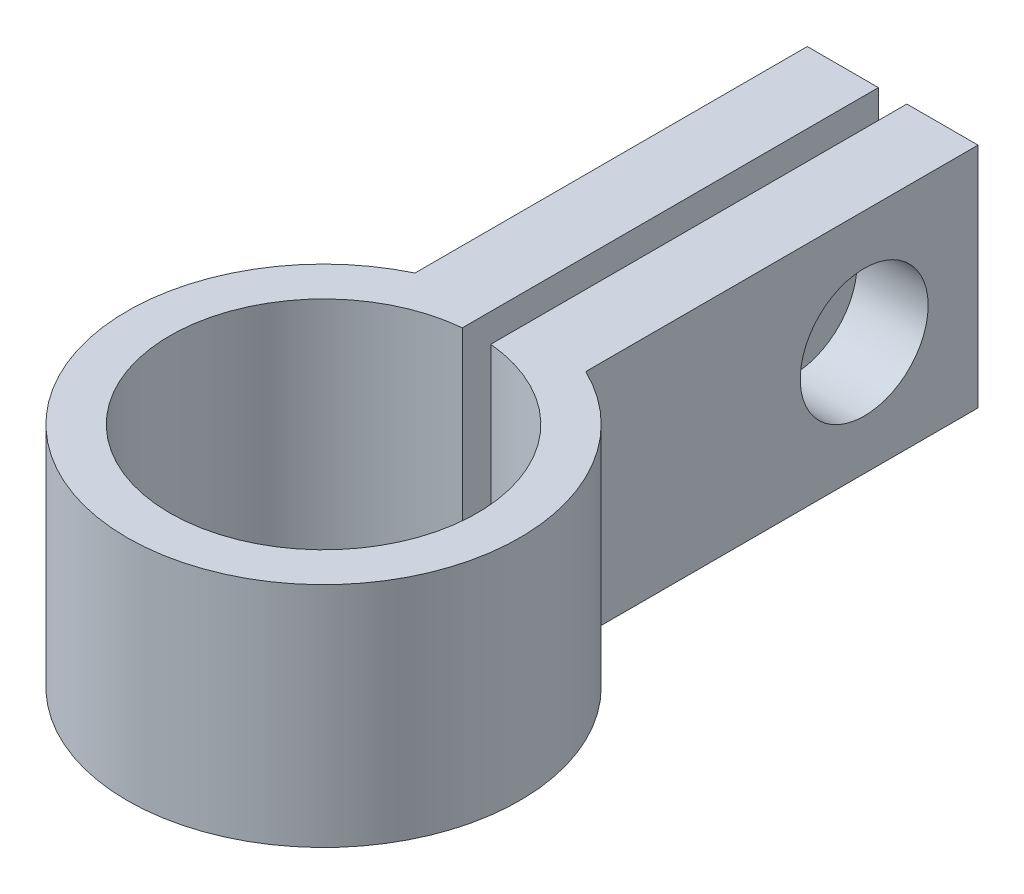
ISO-10303-21;
HEADER;
FILE_DESCRIPTION(('STEP AP214'),'2;1');
FILE_NAME('part.step','',(''),(''),'','','');
FILE_SCHEMA(('AUTOMOTIVE_DESIGN { 1 0 10303 214 1 1 1 1 }'));
ENDSEC;
DATA;
#1=APPLICATION_CONTEXT('core data for automotive mechanical design processes');
#2=APPLICATION_PROTOCOL_DEFINITION('international standard','automotive_design',2000,#1);
#3=PRODUCT_CONTEXT('',#1,'mechanical');
#4=PRODUCT('Part','Part','',(#3));
#5=PRODUCT_RELATED_PRODUCT_CATEGORY('part','',(#4));
#6=PRODUCT_DEFINITION_FORMATION('','',#4);
#7=PRODUCT_DEFINITION_CONTEXT('part definition',#1,'design');
#8=PRODUCT_DEFINITION('design','',#6,#7);
#9=PRODUCT_DEFINITION_SHAPE('','',#8);
#10=(LENGTH_UNIT() NAMED_UNIT(*) SI_UNIT(.MILLI.,.METRE.));
#11=(NAMED_UNIT(*) PLANE_ANGLE_UNIT() SI_UNIT($,.RADIAN.));
#12=(NAMED_UNIT(*) SI_UNIT($,.STERADIAN.) SOLID_ANGLE_UNIT());
#13=UNCERTAINTY_MEASURE_WITH_UNIT(LENGTH_MEASURE(1.E-05),#10,'distance_accuracy_value','');
#14=(GEOMETRIC_REPRESENTATION_CONTEXT(3) GLOBAL_UNCERTAINTY_ASSIGNED_CONTEXT((#13)) GLOBAL_UNIT_ASSIGNED_CONTEXT((#10,
#11,#12)) REPRESENTATION_CONTEXT('',''));
#15=CARTESIAN_POINT('',(0.,0.,0.));
#16=DIRECTION('',(0.,0.,1.));
#17=DIRECTION('',(1.,0.,0.));
#18=AXIS2_PLACEMENT_3D('',#15,#16,#17);
#19=CARTESIAN_POINT('',(0.,8.,0.));
#20=DIRECTION('',(0.,-1.,0.));
#21=DIRECTION('',(0.,0.,-1.));
#22=AXIS2_PLACEMENT_3D('',#19,#20,#21);
#23=CYLINDRICAL_SURFACE('',#22,5.4);
#24=CARTESIAN_POINT('',(0.,0.,0.));
#25=DIRECTION('',(0.,1.,0.));
#26=DIRECTION('',(0.,0.,1.));
#27=AXIS2_PLACEMENT_3D('',#24,#25,#26);
#28=CIRCLE('',#27,5.4);
#29=CARTESIAN_POINT('',(-0.5,0.,-5.37680202350803));
#30=VERTEX_POINT('',#29);
#31=CARTESIAN_POINT('',(0.5,0.,-5.37680202350803));
#32=VERTEX_POINT('',#31);
#33=EDGE_CURVE('E131',#30,#32,#28,.T.);
#34=ORIENTED_EDGE('',*,*,#33,.F.);
#35=DIRECTION('',(0.,-1.,0.));
#36=VECTOR('',#35,1.);
#37=CARTESIAN_POINT('',(-0.5,8.,-5.37680202350803));
#38=LINE('',#37,#36);
#39=CARTESIAN_POINT('',(-0.5,8.,-5.37680202350803));
#40=VERTEX_POINT('',#39);
#41=EDGE_CURVE('E11',#40,#30,#38,.T.);
#42=ORIENTED_EDGE('',*,*,#41,.F.);
#43=CARTESIAN_POINT('',(0.,8.,0.));
#44=DIRECTION('',(0.,1.,0.));
#45=DIRECTION('',(0.,0.,1.));
#46=AXIS2_PLACEMENT_3D('',#43,#44,#45);
#47=CIRCLE('',#46,5.4);
#48=CARTESIAN_POINT('',(0.5,8.,-5.37680202350803));
#49=VERTEX_POINT('',#48);
#50=EDGE_CURVE('E150',#40,#49,#47,.T.);
#51=ORIENTED_EDGE('',*,*,#50,.T.);
#52=DIRECTION('',(0.,-1.,0.));
#53=VECTOR('',#52,1.);
#54=CARTESIAN_POINT('',(0.5,8.,-5.37680202350803));
#55=LINE('',#54,#53);
#56=EDGE_CURVE('E52',#49,#32,#55,.T.);
#57=ORIENTED_EDGE('',*,*,#56,.T.);
#58=EDGE_LOOP('',(#34,#42,#51,#57));
#59=FACE_BOUND('',#58,.T.);
#60=ADVANCED_FACE('F35',(#59),#23,.F.);
#61=CARTESIAN_POINT('',(-0.5,8.,0.));
#62=DIRECTION('',(-1.,0.,0.));
#63=DIRECTION('',(0.,0.,1.));
#64=AXIS2_PLACEMENT_3D('',#61,#62,#63);
#65=PLANE('',#64);
#66=CARTESIAN_POINT('',(-0.5,4.,-16.));
#67=DIRECTION('',(-1.,0.,0.));
#68=DIRECTION('',(0.,0.,1.));
#69=AXIS2_PLACEMENT_3D('',#66,#67,#68);
#70=CIRCLE('',#69,2.2479);
#71=CARTESIAN_POINT('',(-0.5,4.,-13.7521));
#72=VERTEX_POINT('',#71);
#73=EDGE_CURVE('E184',#72,#72,#70,.T.);
#74=ORIENTED_EDGE('',*,*,#73,.T.);
#75=EDGE_LOOP('',(#74));
#76=FACE_BOUND('',#75,.T.);
#77=DIRECTION('',(0.,0.,-1.));
#78=VECTOR('',#77,1.);
#79=CARTESIAN_POINT('',(-0.5,0.,0.));
#80=LINE('',#79,#78);
#81=CARTESIAN_POINT('',(-0.5,0.,-20.));
#82=VERTEX_POINT('',#81);
#83=EDGE_CURVE('E133',#30,#82,#80,.T.);
#84=ORIENTED_EDGE('',*,*,#83,.T.);
#85=DIRECTION('',(0.,-1.,0.));
#86=VECTOR('',#85,1.);
#87=CARTESIAN_POINT('',(-0.5,8.,-20.));
#88=LINE('',#87,#86);
#89=CARTESIAN_POINT('',(-0.5,8.,-20.));
#90=VERTEX_POINT('',#89);
#91=EDGE_CURVE('E44',#90,#82,#88,.T.);
#92=ORIENTED_EDGE('',*,*,#91,.F.);
#93=DIRECTION('',(0.,0.,-1.));
#94=VECTOR('',#93,1.);
#95=CARTESIAN_POINT('',(-0.5,8.,0.));
#96=LINE('',#95,#94);
#97=EDGE_CURVE('E177',#40,#90,#96,.T.);
#98=ORIENTED_EDGE('',*,*,#97,.F.);
#99=ORIENTED_EDGE('',*,*,#41,.T.);
#100=EDGE_LOOP('',(#84,#92,#98,#99));
#101=FACE_BOUND('',#100,.T.);
#102=ADVANCED_FACE('F200',(#76,#101),#65,.F.);
#103=CARTESIAN_POINT('',(0.,8.,-20.));
#104=DIRECTION('',(0.,0.,1.));
#105=DIRECTION('',(1.,0.,0.));
#106=AXIS2_PLACEMENT_3D('',#103,#104,#105);
#107=PLANE('',#106);
#108=DIRECTION('',(-1.,0.,0.));
#109=VECTOR('',#108,1.);
#110=CARTESIAN_POINT('',(0.,0.,-20.));
#111=LINE('',#110,#109);
#112=CARTESIAN_POINT('',(-3.,0.,-20.));
#113=VERTEX_POINT('',#112);
#114=EDGE_CURVE('E136',#82,#113,#111,.T.);
#115=ORIENTED_EDGE('',*,*,#114,.T.);
#116=DIRECTION('',(0.,-1.,0.));
#117=VECTOR('',#116,1.);
#118=CARTESIAN_POINT('',(-3.,8.,-20.));
#119=LINE('',#118,#117);
#120=CARTESIAN_POINT('',(-3.,8.,-20.));
#121=VERTEX_POINT('',#120);
#122=EDGE_CURVE('E156',#121,#113,#119,.T.);
#123=ORIENTED_EDGE('',*,*,#122,.F.);
#124=DIRECTION('',(-1.,0.,0.));
#125=VECTOR('',#124,1.);
#126=CARTESIAN_POINT('',(0.,8.,-20.));
#127=LINE('',#126,#125);
#128=EDGE_CURVE('E165',#90,#121,#127,.T.);
#129=ORIENTED_EDGE('',*,*,#128,.F.);
#130=ORIENTED_EDGE('',*,*,#91,.T.);
#131=EDGE_LOOP('',(#115,#123,#129,#130));
#132=FACE_BOUND('',#131,.T.);
#133=ADVANCED_FACE('F163',(#132),#107,.F.);
#134=CARTESIAN_POINT('',(-3.,8.,0.));
#135=DIRECTION('',(-1.,0.,0.));
#136=DIRECTION('',(0.,0.,1.));
#137=AXIS2_PLACEMENT_3D('',#134,#135,#136);
#138=PLANE('',#137);
#139=CARTESIAN_POINT('',(-3.,4.,-16.));
#140=DIRECTION('',(-1.,0.,0.));
#141=DIRECTION('',(0.,0.,1.));
#142=AXIS2_PLACEMENT_3D('',#139,#140,#141);
#143=CIRCLE('',#142,2.2479);
#144=CARTESIAN_POINT('',(-3.,4.,-13.7521));
#145=VERTEX_POINT('',#144);
#146=EDGE_CURVE('E134',#145,#145,#143,.T.);
#147=ORIENTED_EDGE('',*,*,#146,.F.);
#148=EDGE_LOOP('',(#147));
#149=FACE_BOUND('',#148,.T.);
#150=DIRECTION('',(0.,0.,-1.));
#151=VECTOR('',#150,1.);
#152=CARTESIAN_POINT('',(-3.,0.,0.));
#153=LINE('',#152,#151);
#154=CARTESIAN_POINT('',(-3.,0.,-6.21369455316239));
#155=VERTEX_POINT('',#154);
#156=EDGE_CURVE('E139',#155,#113,#153,.T.);
#157=ORIENTED_EDGE('',*,*,#156,.F.);
#158=DIRECTION('',(0.,-1.,0.));
#159=VECTOR('',#158,1.);
#160=CARTESIAN_POINT('',(-3.,8.,-6.21369455316239));
#161=LINE('',#160,#159);
#162=CARTESIAN_POINT('',(-3.,8.,-6.21369455316239));
#163=VERTEX_POINT('',#162);
#164=EDGE_CURVE('E154',#163,#155,#161,.T.);
#165=ORIENTED_EDGE('',*,*,#164,.F.);
#166=DIRECTION('',(0.,0.,-1.));
#167=VECTOR('',#166,1.);
#168=CARTESIAN_POINT('',(-3.,8.,0.));
#169=LINE('',#168,#167);
#170=EDGE_CURVE('E175',#163,#121,#169,.T.);
#171=ORIENTED_EDGE('',*,*,#170,.T.);
#172=ORIENTED_EDGE('',*,*,#122,.T.);
#173=EDGE_LOOP('',(#157,#165,#171,#172));
#174=FACE_BOUND('',#173,.T.);
#175=ADVANCED_FACE('F173',(#149,#174),#138,.T.);
#176=CARTESIAN_POINT('',(0.,8.,0.));
#177=DIRECTION('',(0.,-1.,0.));
#178=DIRECTION('',(0.,0.,-1.));
#179=AXIS2_PLACEMENT_3D('',#176,#177,#178);
#180=CYLINDRICAL_SURFACE('',#179,6.9);
#181=CARTESIAN_POINT('',(0.,0.,0.));
#182=DIRECTION('',(0.,1.,0.));
#183=DIRECTION('',(0.,0.,1.));
#184=AXIS2_PLACEMENT_3D('',#181,#182,#183);
#185=CIRCLE('',#184,6.9);
#186=CARTESIAN_POINT('',(3.,0.,-6.21369455316239));
#187=VERTEX_POINT('',#186);
#188=EDGE_CURVE('E142',#155,#187,#185,.T.);
#189=ORIENTED_EDGE('',*,*,#188,.T.);
#190=DIRECTION('',(0.,-1.,0.));
#191=VECTOR('',#190,1.);
#192=CARTESIAN_POINT('',(3.,8.,-6.21369455316239));
#193=LINE('',#192,#191);
#194=CARTESIAN_POINT('',(3.,8.,-6.21369455316239));
#195=VERTEX_POINT('',#194);
#196=EDGE_CURVE('E123',#195,#187,#193,.T.);
#197=ORIENTED_EDGE('',*,*,#196,.F.);
#198=CARTESIAN_POINT('',(0.,8.,0.));
#199=DIRECTION('',(0.,1.,0.));
#200=DIRECTION('',(0.,0.,1.));
#201=AXIS2_PLACEMENT_3D('',#198,#199,#200);
#202=CIRCLE('',#201,6.9);
#203=EDGE_CURVE('E111',#163,#195,#202,.T.);
#204=ORIENTED_EDGE('',*,*,#203,.F.);
#205=ORIENTED_EDGE('',*,*,#164,.T.);
#206=EDGE_LOOP('',(#189,#197,#204,#205));
#207=FACE_BOUND('',#206,.T.);
#208=ADVANCED_FACE('F212',(#207),#180,.T.);
#209=CARTESIAN_POINT('',(3.,8.,0.));
#210=DIRECTION('',(-1.,0.,0.));
#211=DIRECTION('',(0.,0.,1.));
#212=AXIS2_PLACEMENT_3D('',#209,#210,#211);
#213=PLANE('',#212);
#214=CARTESIAN_POINT('',(3.,4.,-16.));
#215=DIRECTION('',(1.,0.,0.));
#216=DIRECTION('',(0.,0.,-1.));
#217=AXIS2_PLACEMENT_3D('',#214,#215,#216);
#218=CIRCLE('',#217,2.2479);
#219=CARTESIAN_POINT('',(3.,4.,-18.2479));
#220=VERTEX_POINT('',#219);
#221=EDGE_CURVE('E187',#220,#220,#218,.T.);
#222=ORIENTED_EDGE('',*,*,#221,.F.);
#223=EDGE_LOOP('',(#222));
#224=FACE_BOUND('',#223,.T.);
#225=DIRECTION('',(0.,0.,-1.));
#226=VECTOR('',#225,1.);
#227=CARTESIAN_POINT('',(3.,0.,0.));
#228=LINE('',#227,#226);
#229=CARTESIAN_POINT('',(3.,0.,-20.));
#230=VERTEX_POINT('',#229);
#231=EDGE_CURVE('E120',#187,#230,#228,.T.);
#232=ORIENTED_EDGE('',*,*,#231,.T.);
#233=DIRECTION('',(0.,-1.,0.));
#234=VECTOR('',#233,1.);
#235=CARTESIAN_POINT('',(3.,8.,-20.));
#236=LINE('',#235,#234);
#237=CARTESIAN_POINT('',(3.,8.,-20.));
#238=VERTEX_POINT('',#237);
#239=EDGE_CURVE('E117',#238,#230,#236,.T.);
#240=ORIENTED_EDGE('',*,*,#239,.F.);
#241=DIRECTION('',(0.,0.,-1.));
#242=VECTOR('',#241,1.);
#243=CARTESIAN_POINT('',(3.,8.,0.));
#244=LINE('',#243,#242);
#245=EDGE_CURVE('E102',#195,#238,#244,.T.);
#246=ORIENTED_EDGE('',*,*,#245,.F.);
#247=ORIENTED_EDGE('',*,*,#196,.T.);
#248=EDGE_LOOP('',(#232,#240,#246,#247));
#249=FACE_BOUND('',#248,.T.);
#250=ADVANCED_FACE('F118',(#224,#249),#213,.F.);
#251=CARTESIAN_POINT('',(0.,8.,-20.));
#252=DIRECTION('',(0.,0.,1.));
#253=DIRECTION('',(1.,0.,0.));
#254=AXIS2_PLACEMENT_3D('',#251,#252,#253);
#255=PLANE('',#254);
#256=DIRECTION('',(-1.,0.,0.));
#257=VECTOR('',#256,1.);
#258=CARTESIAN_POINT('',(0.,0.,-20.));
#259=LINE('',#258,#257);
#260=CARTESIAN_POINT('',(0.5,0.,-20.));
#261=VERTEX_POINT('',#260);
#262=EDGE_CURVE('E145',#230,#261,#259,.T.);
#263=ORIENTED_EDGE('',*,*,#262,.T.);
#264=DIRECTION('',(0.,-1.,0.));
#265=VECTOR('',#264,1.);
#266=CARTESIAN_POINT('',(0.5,8.,-20.));
#267=LINE('',#266,#265);
#268=CARTESIAN_POINT('',(0.5,8.,-20.));
#269=VERTEX_POINT('',#268);
#270=EDGE_CURVE('E78',#269,#261,#267,.T.);
#271=ORIENTED_EDGE('',*,*,#270,.F.);
#272=DIRECTION('',(-1.,0.,0.));
#273=VECTOR('',#272,1.);
#274=CARTESIAN_POINT('',(0.,8.,-20.));
#275=LINE('',#274,#273);
#276=EDGE_CURVE('E108',#238,#269,#275,.T.);
#277=ORIENTED_EDGE('',*,*,#276,.F.);
#278=ORIENTED_EDGE('',*,*,#239,.T.);
#279=EDGE_LOOP('',(#263,#271,#277,#278));
#280=FACE_BOUND('',#279,.T.);
#281=ADVANCED_FACE('F125',(#280),#255,.F.);
#282=CARTESIAN_POINT('',(0.5,8.,0.));
#283=DIRECTION('',(-1.,0.,0.));
#284=DIRECTION('',(0.,0.,1.));
#285=AXIS2_PLACEMENT_3D('',#282,#283,#284);
#286=PLANE('',#285);
#287=CARTESIAN_POINT('',(0.5,4.,-16.));
#288=DIRECTION('',(-1.,0.,0.));
#289=DIRECTION('',(0.,0.,1.));
#290=AXIS2_PLACEMENT_3D('',#287,#288,#289);
#291=CIRCLE('',#290,2.2479);
#292=CARTESIAN_POINT('',(0.5,4.,-13.7521));
#293=VERTEX_POINT('',#292);
#294=EDGE_CURVE('E38',#293,#293,#291,.T.);
#295=ORIENTED_EDGE('',*,*,#294,.F.);
#296=EDGE_LOOP('',(#295));
#297=FACE_BOUND('',#296,.T.);
#298=DIRECTION('',(0.,0.,-1.));
#299=VECTOR('',#298,1.);
#300=CARTESIAN_POINT('',(0.5,0.,0.));
#301=LINE('',#300,#299);
#302=EDGE_CURVE('E147',#32,#261,#301,.T.);
#303=ORIENTED_EDGE('',*,*,#302,.F.);
#304=ORIENTED_EDGE('',*,*,#56,.F.);
#305=DIRECTION('',(0.,0.,-1.));
#306=VECTOR('',#305,1.);
#307=CARTESIAN_POINT('',(0.5,8.,0.));
#308=LINE('',#307,#306);
#309=EDGE_CURVE('E126',#49,#269,#308,.T.);
#310=ORIENTED_EDGE('',*,*,#309,.T.);
#311=ORIENTED_EDGE('',*,*,#270,.T.);
#312=EDGE_LOOP('',(#303,#304,#310,#311));
#313=FACE_BOUND('',#312,.T.);
#314=ADVANCED_FACE('F196',(#297,#313),#286,.T.);
#315=CARTESIAN_POINT('',(0.,8.,0.));
#316=DIRECTION('',(0.,1.,0.));
#317=DIRECTION('',(0.,0.,1.));
#318=AXIS2_PLACEMENT_3D('',#315,#316,#317);
#319=PLANE('',#318);
#320=ORIENTED_EDGE('',*,*,#50,.F.);
#321=ORIENTED_EDGE('',*,*,#97,.T.);
#322=ORIENTED_EDGE('',*,*,#128,.T.);
#323=ORIENTED_EDGE('',*,*,#170,.F.);
#324=ORIENTED_EDGE('',*,*,#203,.T.);
#325=ORIENTED_EDGE('',*,*,#245,.T.);
#326=ORIENTED_EDGE('',*,*,#276,.T.);
#327=ORIENTED_EDGE('',*,*,#309,.F.);
#328=EDGE_LOOP('',(#320,#321,#322,#323,#324,#325,#326,#327));
#329=FACE_BOUND('',#328,.T.);
#330=ADVANCED_FACE('F105',(#329),#319,.T.);
#331=CARTESIAN_POINT('',(0.,0.,0.));
#332=DIRECTION('',(0.,1.,0.));
#333=DIRECTION('',(0.,0.,1.));
#334=AXIS2_PLACEMENT_3D('',#331,#332,#333);
#335=PLANE('',#334);
#336=ORIENTED_EDGE('',*,*,#33,.T.);
#337=ORIENTED_EDGE('',*,*,#302,.T.);
#338=ORIENTED_EDGE('',*,*,#262,.F.);
#339=ORIENTED_EDGE('',*,*,#231,.F.);
#340=ORIENTED_EDGE('',*,*,#188,.F.);
#341=ORIENTED_EDGE('',*,*,#156,.T.);
#342=ORIENTED_EDGE('',*,*,#114,.F.);
#343=ORIENTED_EDGE('',*,*,#83,.F.);
#344=EDGE_LOOP('',(#336,#337,#338,#339,#340,#341,#342,#343));
#345=FACE_BOUND('',#344,.T.);
#346=ADVANCED_FACE('F169',(#345),#335,.F.);
#347=CARTESIAN_POINT('',(3.,4.,-16.));
#348=DIRECTION('',(1.,0.,0.));
#349=DIRECTION('',(0.,0.,-1.));
#350=AXIS2_PLACEMENT_3D('',#347,#348,#349);
#351=CYLINDRICAL_SURFACE('',#350,2.2479);
#352=ORIENTED_EDGE('',*,*,#294,.T.);
#353=EDGE_LOOP('',(#352));
#354=FACE_BOUND('',#353,.T.);
#355=ORIENTED_EDGE('',*,*,#221,.T.);
#356=EDGE_LOOP('',(#355));
#357=FACE_BOUND('',#356,.T.);
#358=ADVANCED_FACE('F194',(#354,#357),#351,.F.);
#359=ORIENTED_EDGE('',*,*,#146,.T.);
#360=EDGE_LOOP('',(#359));
#361=FACE_BOUND('',#360,.T.);
#362=ORIENTED_EDGE('',*,*,#73,.F.);
#363=EDGE_LOOP('',(#362));
#364=FACE_BOUND('',#363,.T.);
#365=ADVANCED_FACE('F227',(#361,#364),#351,.F.);
#366=CLOSED_SHELL('',(#60,#102,#133,#175,#208,#250,#281,#314,#330,#346,#358,#365));
#367=MANIFOLD_SOLID_BREP('B2',#366);
#368=ADVANCED_BREP_SHAPE_REPRESENTATION('',(#18,#367),#14);
#369=SHAPE_DEFINITION_REPRESENTATION(#9,#368);
ENDSEC;
END-ISO-10303-21;
